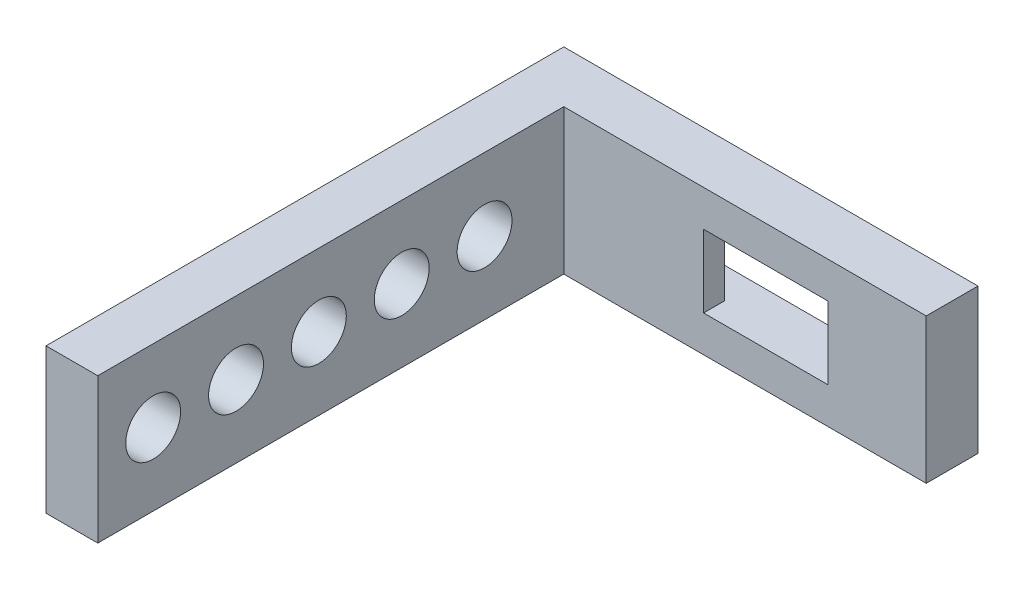
ISO-10303-21;
HEADER;
FILE_DESCRIPTION(('STEP AP214'),'2;1');
FILE_NAME('part.step','',(''),(''),'','','');
FILE_SCHEMA(('AUTOMOTIVE_DESIGN { 1 0 10303 214 1 1 1 1 }'));
ENDSEC;
DATA;
#1=APPLICATION_CONTEXT('core data for automotive mechanical design processes');
#2=APPLICATION_PROTOCOL_DEFINITION('international standard','automotive_design',2000,#1);
#3=PRODUCT_CONTEXT('',#1,'mechanical');
#4=PRODUCT('Part','Part','',(#3));
#5=PRODUCT_RELATED_PRODUCT_CATEGORY('part','',(#4));
#6=PRODUCT_DEFINITION_FORMATION('','',#4);
#7=PRODUCT_DEFINITION_CONTEXT('part definition',#1,'design');
#8=PRODUCT_DEFINITION('design','',#6,#7);
#9=PRODUCT_DEFINITION_SHAPE('','',#8);
#10=(LENGTH_UNIT() NAMED_UNIT(*) SI_UNIT(.MILLI.,.METRE.));
#11=(NAMED_UNIT(*) PLANE_ANGLE_UNIT() SI_UNIT($,.RADIAN.));
#12=(NAMED_UNIT(*) SI_UNIT($,.STERADIAN.) SOLID_ANGLE_UNIT());
#13=UNCERTAINTY_MEASURE_WITH_UNIT(LENGTH_MEASURE(1.E-05),#10,'distance_accuracy_value','');
#14=(GEOMETRIC_REPRESENTATION_CONTEXT(3) GLOBAL_UNCERTAINTY_ASSIGNED_CONTEXT((#13)) GLOBAL_UNIT_ASSIGNED_CONTEXT((#10,
#11,#12)) REPRESENTATION_CONTEXT('',''));
#15=CARTESIAN_POINT('',(0.,0.,0.));
#16=DIRECTION('',(0.,0.,1.));
#17=DIRECTION('',(1.,0.,0.));
#18=AXIS2_PLACEMENT_3D('',#15,#16,#17);
#19=CARTESIAN_POINT('',(0.,0.,-6.));
#20=DIRECTION('',(0.,0.,1.));
#21=DIRECTION('',(1.,0.,0.));
#22=AXIS2_PLACEMENT_3D('',#19,#20,#21);
#23=PLANE('',#22);
#24=DIRECTION('',(0.,-1.,0.));
#25=VECTOR('',#24,1.);
#26=CARTESIAN_POINT('',(30.5,10.5,-6.));
#27=LINE('',#26,#25);
#28=CARTESIAN_POINT('',(30.5,10.5,-6.));
#29=VERTEX_POINT('',#28);
#30=CARTESIAN_POINT('',(30.5,3.5,-6.));
#31=VERTEX_POINT('',#30);
#32=EDGE_CURVE('E143',#29,#31,#27,.T.);
#33=ORIENTED_EDGE('',*,*,#32,.F.);
#34=DIRECTION('',(1.,0.,0.));
#35=VECTOR('',#34,1.);
#36=CARTESIAN_POINT('',(12.,10.5,-6.));
#37=LINE('',#36,#35);
#38=CARTESIAN_POINT('',(37.,10.5,-6.));
#39=VERTEX_POINT('',#38);
#40=EDGE_CURVE('E174',#29,#39,#37,.T.);
#41=ORIENTED_EDGE('',*,*,#40,.T.);
#42=DIRECTION('',(0.,-1.,0.));
#43=VECTOR('',#42,1.);
#44=CARTESIAN_POINT('',(37.,10.5,-6.));
#45=LINE('',#44,#43);
#46=CARTESIAN_POINT('',(37.,3.5,-6.));
#47=VERTEX_POINT('',#46);
#48=EDGE_CURVE('E179',#39,#47,#45,.T.);
#49=ORIENTED_EDGE('',*,*,#48,.T.);
#50=DIRECTION('',(-1.,0.,0.));
#51=VECTOR('',#50,1.);
#52=CARTESIAN_POINT('',(12.,3.5,-6.));
#53=LINE('',#52,#51);
#54=EDGE_CURVE('E183',#47,#31,#53,.T.);
#55=ORIENTED_EDGE('',*,*,#54,.T.);
#56=EDGE_LOOP('',(#33,#41,#49,#55));
#57=FACE_BOUND('',#56,.T.);
#58=ADVANCED_FACE('F36',(#57),#23,.F.);
#59=DIRECTION('',(0.,1.,0.));
#60=VECTOR('',#59,1.);
#61=CARTESIAN_POINT('',(18.5,10.5,-6.));
#62=LINE('',#61,#60);
#63=CARTESIAN_POINT('',(18.5,3.5,-6.));
#64=VERTEX_POINT('',#63);
#65=CARTESIAN_POINT('',(18.5,10.5,-6.));
#66=VERTEX_POINT('',#65);
#67=EDGE_CURVE('E147',#64,#66,#62,.T.);
#68=ORIENTED_EDGE('',*,*,#67,.F.);
#69=CARTESIAN_POINT('',(12.,3.5,-6.));
#70=VERTEX_POINT('',#69);
#71=EDGE_CURVE('E182',#64,#70,#53,.T.);
#72=ORIENTED_EDGE('',*,*,#71,.T.);
#73=DIRECTION('',(0.,1.,0.));
#74=VECTOR('',#73,1.);
#75=CARTESIAN_POINT('',(12.,10.5,-6.));
#76=LINE('',#75,#74);
#77=CARTESIAN_POINT('',(12.,10.5,-6.));
#78=VERTEX_POINT('',#77);
#79=EDGE_CURVE('E171',#70,#78,#76,.T.);
#80=ORIENTED_EDGE('',*,*,#79,.T.);
#81=EDGE_CURVE('E176',#78,#66,#37,.T.);
#82=ORIENTED_EDGE('',*,*,#81,.T.);
#83=EDGE_LOOP('',(#68,#72,#80,#82));
#84=FACE_BOUND('',#83,.T.);
#85=ADVANCED_FACE('F301',(#84),#23,.F.);
#86=CARTESIAN_POINT('',(10.,14.,-4.));
#87=DIRECTION('',(0.,0.,-1.));
#88=DIRECTION('',(-1.,0.,0.));
#89=AXIS2_PLACEMENT_3D('',#86,#87,#88);
#90=PLANE('',#89);
#91=DIRECTION('',(-1.,0.,0.));
#92=VECTOR('',#91,1.);
#93=CARTESIAN_POINT('',(18.5,10.5,-4.));
#94=LINE('',#93,#92);
#95=CARTESIAN_POINT('',(30.5,10.5,-4.));
#96=VERTEX_POINT('',#95);
#97=CARTESIAN_POINT('',(18.5,10.5,-4.));
#98=VERTEX_POINT('',#97);
#99=EDGE_CURVE('E160',#96,#98,#94,.T.);
#100=ORIENTED_EDGE('',*,*,#99,.F.);
#101=DIRECTION('',(0.,1.,0.));
#102=VECTOR('',#101,1.);
#103=CARTESIAN_POINT('',(30.5,10.5,-4.));
#104=LINE('',#103,#102);
#105=CARTESIAN_POINT('',(30.5,3.5,-4.));
#106=VERTEX_POINT('',#105);
#107=EDGE_CURVE('E140',#106,#96,#104,.T.);
#108=ORIENTED_EDGE('',*,*,#107,.F.);
#109=DIRECTION('',(1.,0.,0.));
#110=VECTOR('',#109,1.);
#111=CARTESIAN_POINT('',(18.5,3.5,-4.));
#112=LINE('',#111,#110);
#113=CARTESIAN_POINT('',(18.5,3.5,-4.));
#114=VERTEX_POINT('',#113);
#115=EDGE_CURVE('E150',#114,#106,#112,.T.);
#116=ORIENTED_EDGE('',*,*,#115,.F.);
#117=DIRECTION('',(0.,-1.,0.));
#118=VECTOR('',#117,1.);
#119=CARTESIAN_POINT('',(18.5,10.5,-4.));
#120=LINE('',#119,#118);
#121=EDGE_CURVE('E56',#98,#114,#120,.T.);
#122=ORIENTED_EDGE('',*,*,#121,.F.);
#123=EDGE_LOOP('',(#100,#108,#116,#122));
#124=FACE_BOUND('',#123,.T.);
#125=DIRECTION('',(1.,0.,0.));
#126=VECTOR('',#125,1.);
#127=CARTESIAN_POINT('',(10.,0.,-4.));
#128=LINE('',#127,#126);
#129=CARTESIAN_POINT('',(5.,0.,-4.));
#130=VERTEX_POINT('',#129);
#131=CARTESIAN_POINT('',(40.,0.,-4.));
#132=VERTEX_POINT('',#131);
#133=EDGE_CURVE('E250',#130,#132,#128,.T.);
#134=ORIENTED_EDGE('',*,*,#133,.T.);
#135=DIRECTION('',(0.,-1.,0.));
#136=VECTOR('',#135,1.);
#137=CARTESIAN_POINT('',(40.,14.,-4.));
#138=LINE('',#137,#136);
#139=CARTESIAN_POINT('',(40.,14.,-4.));
#140=VERTEX_POINT('',#139);
#141=EDGE_CURVE('E11',#140,#132,#138,.T.);
#142=ORIENTED_EDGE('',*,*,#141,.F.);
#143=DIRECTION('',(1.,0.,0.));
#144=VECTOR('',#143,1.);
#145=CARTESIAN_POINT('',(10.,14.,-4.));
#146=LINE('',#145,#144);
#147=CARTESIAN_POINT('',(5.,14.,-4.));
#148=VERTEX_POINT('',#147);
#149=EDGE_CURVE('E253',#148,#140,#146,.T.);
#150=ORIENTED_EDGE('',*,*,#149,.F.);
#151=DIRECTION('',(0.,1.,0.));
#152=VECTOR('',#151,1.);
#153=CARTESIAN_POINT('',(5.,0.,-4.));
#154=LINE('',#153,#152);
#155=EDGE_CURVE('E196',#130,#148,#154,.T.);
#156=ORIENTED_EDGE('',*,*,#155,.F.);
#157=EDGE_LOOP('',(#134,#142,#150,#156));
#158=FACE_BOUND('',#157,.T.);
#159=ADVANCED_FACE('F38',(#124,#158),#90,.F.);
#160=CARTESIAN_POINT('',(40.,14.,-9.));
#161=DIRECTION('',(-1.,0.,0.));
#162=DIRECTION('',(0.,0.,1.));
#163=AXIS2_PLACEMENT_3D('',#160,#161,#162);
#164=PLANE('',#163);
#165=DIRECTION('',(0.,0.,-1.));
#166=VECTOR('',#165,1.);
#167=CARTESIAN_POINT('',(40.,0.,-9.));
#168=LINE('',#167,#166);
#169=CARTESIAN_POINT('',(40.,0.,-9.));
#170=VERTEX_POINT('',#169);
#171=EDGE_CURVE('E264',#132,#170,#168,.T.);
#172=ORIENTED_EDGE('',*,*,#171,.T.);
#173=DIRECTION('',(0.,-1.,0.));
#174=VECTOR('',#173,1.);
#175=CARTESIAN_POINT('',(40.,14.,-9.));
#176=LINE('',#175,#174);
#177=CARTESIAN_POINT('',(40.,14.,-9.));
#178=VERTEX_POINT('',#177);
#179=EDGE_CURVE('E44',#178,#170,#176,.T.);
#180=ORIENTED_EDGE('',*,*,#179,.F.);
#181=DIRECTION('',(0.,0.,-1.));
#182=VECTOR('',#181,1.);
#183=CARTESIAN_POINT('',(40.,14.,-9.));
#184=LINE('',#183,#182);
#185=EDGE_CURVE('E255',#140,#178,#184,.T.);
#186=ORIENTED_EDGE('',*,*,#185,.F.);
#187=ORIENTED_EDGE('',*,*,#141,.T.);
#188=EDGE_LOOP('',(#172,#180,#186,#187));
#189=FACE_BOUND('',#188,.T.);
#190=ADVANCED_FACE('F279',(#189),#164,.F.);
#191=CARTESIAN_POINT('',(0.,14.,-9.));
#192=DIRECTION('',(0.,0.,1.));
#193=DIRECTION('',(1.,0.,0.));
#194=AXIS2_PLACEMENT_3D('',#191,#192,#193);
#195=PLANE('',#194);
#196=DIRECTION('',(1.,0.,0.));
#197=VECTOR('',#196,1.);
#198=CARTESIAN_POINT('',(12.,10.5,-9.));
#199=LINE('',#198,#197);
#200=CARTESIAN_POINT('',(12.,10.5,-9.));
#201=VERTEX_POINT('',#200);
#202=CARTESIAN_POINT('',(37.,10.5,-9.));
#203=VERTEX_POINT('',#202);
#204=EDGE_CURVE('E187',#201,#203,#199,.T.);
#205=ORIENTED_EDGE('',*,*,#204,.F.);
#206=DIRECTION('',(0.,1.,0.));
#207=VECTOR('',#206,1.);
#208=CARTESIAN_POINT('',(12.,10.5,-9.));
#209=LINE('',#208,#207);
#210=CARTESIAN_POINT('',(12.,3.5,-9.));
#211=VERTEX_POINT('',#210);
#212=EDGE_CURVE('E155',#211,#201,#209,.T.);
#213=ORIENTED_EDGE('',*,*,#212,.F.);
#214=DIRECTION('',(-1.,0.,0.));
#215=VECTOR('',#214,1.);
#216=CARTESIAN_POINT('',(12.,3.5,-9.));
#217=LINE('',#216,#215);
#218=CARTESIAN_POINT('',(37.,3.5,-9.));
#219=VERTEX_POINT('',#218);
#220=EDGE_CURVE('E175',#219,#211,#217,.T.);
#221=ORIENTED_EDGE('',*,*,#220,.F.);
#222=DIRECTION('',(0.,-1.,0.));
#223=VECTOR('',#222,1.);
#224=CARTESIAN_POINT('',(37.,10.5,-9.));
#225=LINE('',#224,#223);
#226=EDGE_CURVE('E190',#203,#219,#225,.T.);
#227=ORIENTED_EDGE('',*,*,#226,.F.);
#228=EDGE_LOOP('',(#205,#213,#221,#227));
#229=FACE_BOUND('',#228,.T.);
#230=DIRECTION('',(-1.,0.,0.));
#231=VECTOR('',#230,1.);
#232=CARTESIAN_POINT('',(0.,0.,-9.));
#233=LINE('',#232,#231);
#234=CARTESIAN_POINT('',(0.,0.,-9.));
#235=VERTEX_POINT('',#234);
#236=EDGE_CURVE('E267',#170,#235,#233,.T.);
#237=ORIENTED_EDGE('',*,*,#236,.T.);
#238=DIRECTION('',(0.,-1.,0.));
#239=VECTOR('',#238,1.);
#240=CARTESIAN_POINT('',(0.,14.,-9.));
#241=LINE('',#240,#239);
#242=CARTESIAN_POINT('',(0.,14.,-9.));
#243=VERTEX_POINT('',#242);
#244=EDGE_CURVE('E262',#243,#235,#241,.T.);
#245=ORIENTED_EDGE('',*,*,#244,.F.);
#246=DIRECTION('',(-1.,0.,0.));
#247=VECTOR('',#246,1.);
#248=CARTESIAN_POINT('',(11.5890955973018,14.,-9.));
#249=LINE('',#248,#247);
#250=EDGE_CURVE('E258',#178,#243,#249,.T.);
#251=ORIENTED_EDGE('',*,*,#250,.F.);
#252=ORIENTED_EDGE('',*,*,#179,.T.);
#253=EDGE_LOOP('',(#237,#245,#251,#252));
#254=FACE_BOUND('',#253,.T.);
#255=ADVANCED_FACE('F275',(#229,#254),#195,.F.);
#256=CARTESIAN_POINT('',(0.,14.,0.));
#257=DIRECTION('',(1.,0.,0.));
#258=DIRECTION('',(0.,0.,-1.));
#259=AXIS2_PLACEMENT_3D('',#256,#257,#258);
#260=PLANE('',#259);
#261=CARTESIAN_POINT('',(0.,6.99999999999999,3.65));
#262=DIRECTION('',(-1.,0.,0.));
#263=DIRECTION('',(0.,0.,1.));
#264=AXIS2_PLACEMENT_3D('',#261,#262,#263);
#265=CIRCLE('',#264,2.65);
#266=CARTESIAN_POINT('',(0.,6.99999999999999,6.3));
#267=VERTEX_POINT('',#266);
#268=EDGE_CURVE('E208',#267,#267,#265,.T.);
#269=ORIENTED_EDGE('',*,*,#268,.F.);
#270=EDGE_LOOP('',(#269));
#271=FACE_BOUND('',#270,.T.);
#272=CARTESIAN_POINT('',(0.,6.99999999999999,11.65));
#273=DIRECTION('',(-1.,0.,0.));
#274=DIRECTION('',(0.,0.,1.));
#275=AXIS2_PLACEMENT_3D('',#272,#273,#274);
#276=CIRCLE('',#275,2.65);
#277=CARTESIAN_POINT('',(0.,6.99999999999999,14.3));
#278=VERTEX_POINT('',#277);
#279=EDGE_CURVE('E209',#278,#278,#276,.T.);
#280=ORIENTED_EDGE('',*,*,#279,.F.);
#281=EDGE_LOOP('',(#280));
#282=FACE_BOUND('',#281,.T.);
#283=CARTESIAN_POINT('',(0.,6.99999999999999,19.65));
#284=DIRECTION('',(-1.,0.,0.));
#285=DIRECTION('',(0.,0.,1.));
#286=AXIS2_PLACEMENT_3D('',#283,#284,#285);
#287=CIRCLE('',#286,2.65);
#288=CARTESIAN_POINT('',(0.,6.99999999999999,22.3));
#289=VERTEX_POINT('',#288);
#290=EDGE_CURVE('E216',#289,#289,#287,.T.);
#291=ORIENTED_EDGE('',*,*,#290,.F.);
#292=EDGE_LOOP('',(#291));
#293=FACE_BOUND('',#292,.T.);
#294=CARTESIAN_POINT('',(0.,6.99999999999999,27.65));
#295=DIRECTION('',(-1.,0.,0.));
#296=DIRECTION('',(0.,0.,1.));
#297=AXIS2_PLACEMENT_3D('',#294,#295,#296);
#298=CIRCLE('',#297,2.65);
#299=CARTESIAN_POINT('',(0.,6.99999999999999,30.3));
#300=VERTEX_POINT('',#299);
#301=EDGE_CURVE('E222',#300,#300,#298,.T.);
#302=ORIENTED_EDGE('',*,*,#301,.F.);
#303=EDGE_LOOP('',(#302));
#304=FACE_BOUND('',#303,.T.);
#305=CARTESIAN_POINT('',(0.,6.99999999999999,35.65));
#306=DIRECTION('',(-1.,0.,0.));
#307=DIRECTION('',(0.,0.,1.));
#308=AXIS2_PLACEMENT_3D('',#305,#306,#307);
#309=CIRCLE('',#308,2.65);
#310=CARTESIAN_POINT('',(0.,6.99999999999999,38.3));
#311=VERTEX_POINT('',#310);
#312=EDGE_CURVE('E228',#311,#311,#309,.T.);
#313=ORIENTED_EDGE('',*,*,#312,.F.);
#314=EDGE_LOOP('',(#313));
#315=FACE_BOUND('',#314,.T.);
#316=DIRECTION('',(0.,0.,1.));
#317=VECTOR('',#316,1.);
#318=CARTESIAN_POINT('',(0.,0.,0.));
#319=LINE('',#318,#317);
#320=CARTESIAN_POINT('',(0.,0.,41.));
#321=VERTEX_POINT('',#320);
#322=EDGE_CURVE('E256',#235,#321,#319,.T.);
#323=ORIENTED_EDGE('',*,*,#322,.T.);
#324=DIRECTION('',(0.,1.,0.));
#325=VECTOR('',#324,1.);
#326=CARTESIAN_POINT('',(0.,0.,41.));
#327=LINE('',#326,#325);
#328=CARTESIAN_POINT('',(0.,14.,41.));
#329=VERTEX_POINT('',#328);
#330=EDGE_CURVE('E212',#321,#329,#327,.T.);
#331=ORIENTED_EDGE('',*,*,#330,.T.);
#332=DIRECTION('',(0.,0.,1.));
#333=VECTOR('',#332,1.);
#334=CARTESIAN_POINT('',(0.,14.,0.));
#335=LINE('',#334,#333);
#336=EDGE_CURVE('E260',#243,#329,#335,.T.);
#337=ORIENTED_EDGE('',*,*,#336,.F.);
#338=ORIENTED_EDGE('',*,*,#244,.T.);
#339=EDGE_LOOP('',(#323,#331,#337,#338));
#340=FACE_BOUND('',#339,.T.);
#341=ADVANCED_FACE('F288',(#271,#282,#293,#304,#315,#340),#260,.F.);
#342=CARTESIAN_POINT('',(0.,14.,0.));
#343=DIRECTION('',(0.,-1.,0.));
#344=DIRECTION('',(0.,0.,-1.));
#345=AXIS2_PLACEMENT_3D('',#342,#343,#344);
#346=PLANE('',#345);
#347=DIRECTION('',(0.,0.,-1.));
#348=VECTOR('',#347,1.);
#349=CARTESIAN_POINT('',(5.,14.,0.));
#350=LINE('',#349,#348);
#351=CARTESIAN_POINT('',(5.,14.,41.));
#352=VERTEX_POINT('',#351);
#353=EDGE_CURVE('E241',#352,#148,#350,.T.);
#354=ORIENTED_EDGE('',*,*,#353,.T.);
#355=ORIENTED_EDGE('',*,*,#149,.T.);
#356=ORIENTED_EDGE('',*,*,#185,.T.);
#357=ORIENTED_EDGE('',*,*,#250,.T.);
#358=ORIENTED_EDGE('',*,*,#336,.T.);
#359=DIRECTION('',(-1.,0.,0.));
#360=VECTOR('',#359,1.);
#361=CARTESIAN_POINT('',(5.,14.,41.));
#362=LINE('',#361,#360);
#363=EDGE_CURVE('E247',#352,#329,#362,.T.);
#364=ORIENTED_EDGE('',*,*,#363,.F.);
#365=EDGE_LOOP('',(#354,#355,#356,#357,#358,#364));
#366=FACE_BOUND('',#365,.T.);
#367=ADVANCED_FACE('F291',(#366),#346,.F.);
#368=CARTESIAN_POINT('',(0.,0.,0.));
#369=DIRECTION('',(0.,-1.,0.));
#370=DIRECTION('',(0.,0.,-1.));
#371=AXIS2_PLACEMENT_3D('',#368,#369,#370);
#372=PLANE('',#371);
#373=ORIENTED_EDGE('',*,*,#133,.F.);
#374=DIRECTION('',(0.,0.,1.));
#375=VECTOR('',#374,1.);
#376=CARTESIAN_POINT('',(5.,0.,0.));
#377=LINE('',#376,#375);
#378=CARTESIAN_POINT('',(5.,0.,41.));
#379=VERTEX_POINT('',#378);
#380=EDGE_CURVE('E235',#130,#379,#377,.T.);
#381=ORIENTED_EDGE('',*,*,#380,.T.);
#382=DIRECTION('',(-1.,0.,0.));
#383=VECTOR('',#382,1.);
#384=CARTESIAN_POINT('',(5.,0.,41.));
#385=LINE('',#384,#383);
#386=EDGE_CURVE('E244',#379,#321,#385,.T.);
#387=ORIENTED_EDGE('',*,*,#386,.T.);
#388=ORIENTED_EDGE('',*,*,#322,.F.);
#389=ORIENTED_EDGE('',*,*,#236,.F.);
#390=ORIENTED_EDGE('',*,*,#171,.F.);
#391=EDGE_LOOP('',(#373,#381,#387,#388,#389,#390));
#392=FACE_BOUND('',#391,.T.);
#393=ADVANCED_FACE('F283',(#392),#372,.T.);
#394=CARTESIAN_POINT('',(5.,0.,41.));
#395=DIRECTION('',(0.,0.,1.));
#396=DIRECTION('',(1.,0.,0.));
#397=AXIS2_PLACEMENT_3D('',#394,#395,#396);
#398=PLANE('',#397);
#399=ORIENTED_EDGE('',*,*,#330,.F.);
#400=ORIENTED_EDGE('',*,*,#386,.F.);
#401=DIRECTION('',(0.,1.,0.));
#402=VECTOR('',#401,1.);
#403=CARTESIAN_POINT('',(5.,0.,41.));
#404=LINE('',#403,#402);
#405=EDGE_CURVE('E238',#379,#352,#404,.T.);
#406=ORIENTED_EDGE('',*,*,#405,.T.);
#407=ORIENTED_EDGE('',*,*,#363,.T.);
#408=EDGE_LOOP('',(#399,#400,#406,#407));
#409=FACE_BOUND('',#408,.T.);
#410=ADVANCED_FACE('F293',(#409),#398,.T.);
#411=CARTESIAN_POINT('',(5.,0.,0.));
#412=DIRECTION('',(1.,0.,0.));
#413=DIRECTION('',(0.,0.,-1.));
#414=AXIS2_PLACEMENT_3D('',#411,#412,#413);
#415=PLANE('',#414);
#416=CARTESIAN_POINT('',(5.,6.99999999999999,3.65));
#417=DIRECTION('',(1.,0.,0.));
#418=DIRECTION('',(0.,0.,-1.));
#419=AXIS2_PLACEMENT_3D('',#416,#417,#418);
#420=CIRCLE('',#419,2.65);
#421=CARTESIAN_POINT('',(5.,6.99999999999999,1.));
#422=VERTEX_POINT('',#421);
#423=EDGE_CURVE('E205',#422,#422,#420,.F.);
#424=ORIENTED_EDGE('',*,*,#423,.T.);
#425=EDGE_LOOP('',(#424));
#426=FACE_BOUND('',#425,.T.);
#427=CARTESIAN_POINT('',(5.,6.99999999999999,11.65));
#428=DIRECTION('',(1.,0.,0.));
#429=DIRECTION('',(0.,0.,-1.));
#430=AXIS2_PLACEMENT_3D('',#427,#428,#429);
#431=CIRCLE('',#430,2.65);
#432=CARTESIAN_POINT('',(5.,6.99999999999999,9.));
#433=VERTEX_POINT('',#432);
#434=EDGE_CURVE('E213',#433,#433,#431,.F.);
#435=ORIENTED_EDGE('',*,*,#434,.T.);
#436=EDGE_LOOP('',(#435));
#437=FACE_BOUND('',#436,.T.);
#438=CARTESIAN_POINT('',(5.,6.99999999999999,19.65));
#439=DIRECTION('',(1.,0.,0.));
#440=DIRECTION('',(0.,0.,-1.));
#441=AXIS2_PLACEMENT_3D('',#438,#439,#440);
#442=CIRCLE('',#441,2.65);
#443=CARTESIAN_POINT('',(5.,6.99999999999999,17.));
#444=VERTEX_POINT('',#443);
#445=EDGE_CURVE('E219',#444,#444,#442,.F.);
#446=ORIENTED_EDGE('',*,*,#445,.T.);
#447=EDGE_LOOP('',(#446));
#448=FACE_BOUND('',#447,.T.);
#449=CARTESIAN_POINT('',(5.,6.99999999999999,27.65));
#450=DIRECTION('',(1.,0.,0.));
#451=DIRECTION('',(0.,0.,-1.));
#452=AXIS2_PLACEMENT_3D('',#449,#450,#451);
#453=CIRCLE('',#452,2.65);
#454=CARTESIAN_POINT('',(5.,6.99999999999999,25.));
#455=VERTEX_POINT('',#454);
#456=EDGE_CURVE('E225',#455,#455,#453,.F.);
#457=ORIENTED_EDGE('',*,*,#456,.T.);
#458=EDGE_LOOP('',(#457));
#459=FACE_BOUND('',#458,.T.);
#460=CARTESIAN_POINT('',(5.,6.99999999999999,35.65));
#461=DIRECTION('',(1.,0.,0.));
#462=DIRECTION('',(0.,0.,-1.));
#463=AXIS2_PLACEMENT_3D('',#460,#461,#462);
#464=CIRCLE('',#463,2.65);
#465=CARTESIAN_POINT('',(5.,6.99999999999999,33.));
#466=VERTEX_POINT('',#465);
#467=EDGE_CURVE('E204',#466,#466,#464,.F.);
#468=ORIENTED_EDGE('',*,*,#467,.T.);
#469=EDGE_LOOP('',(#468));
#470=FACE_BOUND('',#469,.T.);
#471=ORIENTED_EDGE('',*,*,#380,.F.);
#472=ORIENTED_EDGE('',*,*,#155,.T.);
#473=ORIENTED_EDGE('',*,*,#353,.F.);
#474=ORIENTED_EDGE('',*,*,#405,.F.);
#475=EDGE_LOOP('',(#471,#472,#473,#474));
#476=FACE_BOUND('',#475,.T.);
#477=ADVANCED_FACE('F297',(#426,#437,#448,#459,#470,#476),#415,.T.);
#478=CARTESIAN_POINT('',(12.4953318805774,6.99999999999999,35.65));
#479=DIRECTION('',(-1.,0.,0.));
#480=DIRECTION('',(0.,0.,1.));
#481=AXIS2_PLACEMENT_3D('',#478,#479,#480);
#482=CYLINDRICAL_SURFACE('',#481,2.65);
#483=ORIENTED_EDGE('',*,*,#312,.T.);
#484=EDGE_LOOP('',(#483));
#485=FACE_BOUND('',#484,.T.);
#486=ORIENTED_EDGE('',*,*,#467,.F.);
#487=EDGE_LOOP('',(#486));
#488=FACE_BOUND('',#487,.T.);
#489=ADVANCED_FACE('F344',(#485,#488),#482,.F.);
#490=CARTESIAN_POINT('',(12.4953318805774,6.99999999999999,27.65));
#491=DIRECTION('',(-1.,0.,0.));
#492=DIRECTION('',(0.,0.,1.));
#493=AXIS2_PLACEMENT_3D('',#490,#491,#492);
#494=CYLINDRICAL_SURFACE('',#493,2.65);
#495=ORIENTED_EDGE('',*,*,#301,.T.);
#496=EDGE_LOOP('',(#495));
#497=FACE_BOUND('',#496,.T.);
#498=ORIENTED_EDGE('',*,*,#456,.F.);
#499=EDGE_LOOP('',(#498));
#500=FACE_BOUND('',#499,.T.);
#501=ADVANCED_FACE('F340',(#497,#500),#494,.F.);
#502=CARTESIAN_POINT('',(12.4953318805774,6.99999999999999,19.65));
#503=DIRECTION('',(-1.,0.,0.));
#504=DIRECTION('',(0.,0.,1.));
#505=AXIS2_PLACEMENT_3D('',#502,#503,#504);
#506=CYLINDRICAL_SURFACE('',#505,2.65);
#507=ORIENTED_EDGE('',*,*,#290,.T.);
#508=EDGE_LOOP('',(#507));
#509=FACE_BOUND('',#508,.T.);
#510=ORIENTED_EDGE('',*,*,#445,.F.);
#511=EDGE_LOOP('',(#510));
#512=FACE_BOUND('',#511,.T.);
#513=ADVANCED_FACE('F336',(#509,#512),#506,.F.);
#514=CARTESIAN_POINT('',(12.4953318805774,6.99999999999999,11.65));
#515=DIRECTION('',(-1.,0.,0.));
#516=DIRECTION('',(0.,0.,1.));
#517=AXIS2_PLACEMENT_3D('',#514,#515,#516);
#518=CYLINDRICAL_SURFACE('',#517,2.65);
#519=ORIENTED_EDGE('',*,*,#279,.T.);
#520=EDGE_LOOP('',(#519));
#521=FACE_BOUND('',#520,.T.);
#522=ORIENTED_EDGE('',*,*,#434,.F.);
#523=EDGE_LOOP('',(#522));
#524=FACE_BOUND('',#523,.T.);
#525=ADVANCED_FACE('F332',(#521,#524),#518,.F.);
#526=CARTESIAN_POINT('',(12.4953318805774,6.99999999999999,3.65));
#527=DIRECTION('',(-1.,0.,0.));
#528=DIRECTION('',(0.,0.,1.));
#529=AXIS2_PLACEMENT_3D('',#526,#527,#528);
#530=CYLINDRICAL_SURFACE('',#529,2.65);
#531=ORIENTED_EDGE('',*,*,#268,.T.);
#532=EDGE_LOOP('',(#531));
#533=FACE_BOUND('',#532,.T.);
#534=ORIENTED_EDGE('',*,*,#423,.F.);
#535=EDGE_LOOP('',(#534));
#536=FACE_BOUND('',#535,.T.);
#537=ADVANCED_FACE('F328',(#533,#536),#530,.F.);
#538=CARTESIAN_POINT('',(12.,10.5,-6.));
#539=DIRECTION('',(-1.,0.,0.));
#540=DIRECTION('',(0.,0.,1.));
#541=AXIS2_PLACEMENT_3D('',#538,#539,#540);
#542=PLANE('',#541);
#543=ORIENTED_EDGE('',*,*,#212,.T.);
#544=DIRECTION('',(0.,0.,-1.));
#545=VECTOR('',#544,1.);
#546=CARTESIAN_POINT('',(12.,10.5,-6.));
#547=LINE('',#546,#545);
#548=EDGE_CURVE('E185',#78,#201,#547,.T.);
#549=ORIENTED_EDGE('',*,*,#548,.F.);
#550=ORIENTED_EDGE('',*,*,#79,.F.);
#551=DIRECTION('',(0.,0.,-1.));
#552=VECTOR('',#551,1.);
#553=CARTESIAN_POINT('',(12.,3.5,-6.));
#554=LINE('',#553,#552);
#555=EDGE_CURVE('E194',#70,#211,#554,.T.);
#556=ORIENTED_EDGE('',*,*,#555,.T.);
#557=EDGE_LOOP('',(#543,#549,#550,#556));
#558=FACE_BOUND('',#557,.T.);
#559=ADVANCED_FACE('F318',(#558),#542,.F.);
#560=CARTESIAN_POINT('',(12.,3.5,-6.));
#561=DIRECTION('',(0.,-1.,0.));
#562=DIRECTION('',(1.,0.,0.));
#563=AXIS2_PLACEMENT_3D('',#560,#561,#562);
#564=PLANE('',#563);
#565=ORIENTED_EDGE('',*,*,#220,.T.);
#566=ORIENTED_EDGE('',*,*,#555,.F.);
#567=ORIENTED_EDGE('',*,*,#71,.F.);
#568=DIRECTION('',(0.,0.,-1.));
#569=VECTOR('',#568,1.);
#570=CARTESIAN_POINT('',(18.5,3.5,41.001));
#571=LINE('',#570,#569);
#572=EDGE_CURVE('E51',#114,#64,#571,.T.);
#573=ORIENTED_EDGE('',*,*,#572,.F.);
#574=ORIENTED_EDGE('',*,*,#115,.T.);
#575=DIRECTION('',(0.,0.,-1.));
#576=VECTOR('',#575,1.);
#577=CARTESIAN_POINT('',(30.5,3.5,41.001));
#578=LINE('',#577,#576);
#579=EDGE_CURVE('E136',#106,#31,#578,.T.);
#580=ORIENTED_EDGE('',*,*,#579,.T.);
#581=ORIENTED_EDGE('',*,*,#54,.F.);
#582=DIRECTION('',(0.,0.,-1.));
#583=VECTOR('',#582,1.);
#584=CARTESIAN_POINT('',(37.,3.5,-6.));
#585=LINE('',#584,#583);
#586=EDGE_CURVE('E197',#47,#219,#585,.T.);
#587=ORIENTED_EDGE('',*,*,#586,.T.);
#588=EDGE_LOOP('',(#565,#566,#567,#573,#574,#580,#581,#587));
#589=FACE_BOUND('',#588,.T.);
#590=ADVANCED_FACE('F152',(#589),#564,.F.);
#591=CARTESIAN_POINT('',(37.,10.5,-6.));
#592=DIRECTION('',(1.,0.,0.));
#593=DIRECTION('',(0.,0.,-1.));
#594=AXIS2_PLACEMENT_3D('',#591,#592,#593);
#595=PLANE('',#594);
#596=ORIENTED_EDGE('',*,*,#226,.T.);
#597=ORIENTED_EDGE('',*,*,#586,.F.);
#598=ORIENTED_EDGE('',*,*,#48,.F.);
#599=DIRECTION('',(0.,0.,-1.));
#600=VECTOR('',#599,1.);
#601=CARTESIAN_POINT('',(37.,10.5,-6.));
#602=LINE('',#601,#600);
#603=EDGE_CURVE('E199',#39,#203,#602,.T.);
#604=ORIENTED_EDGE('',*,*,#603,.T.);
#605=EDGE_LOOP('',(#596,#597,#598,#604));
#606=FACE_BOUND('',#605,.T.);
#607=ADVANCED_FACE('F317',(#606),#595,.F.);
#608=CARTESIAN_POINT('',(12.,10.5,-6.));
#609=DIRECTION('',(0.,1.,0.));
#610=DIRECTION('',(-1.,0.,0.));
#611=AXIS2_PLACEMENT_3D('',#608,#609,#610);
#612=PLANE('',#611);
#613=ORIENTED_EDGE('',*,*,#204,.T.);
#614=ORIENTED_EDGE('',*,*,#603,.F.);
#615=ORIENTED_EDGE('',*,*,#40,.F.);
#616=DIRECTION('',(0.,0.,-1.));
#617=VECTOR('',#616,1.);
#618=CARTESIAN_POINT('',(30.5,10.5,41.001));
#619=LINE('',#618,#617);
#620=EDGE_CURVE('E156',#96,#29,#619,.T.);
#621=ORIENTED_EDGE('',*,*,#620,.F.);
#622=ORIENTED_EDGE('',*,*,#99,.T.);
#623=DIRECTION('',(0.,0.,-1.));
#624=VECTOR('',#623,1.);
#625=CARTESIAN_POINT('',(18.5,10.5,41.001));
#626=LINE('',#625,#624);
#627=EDGE_CURVE('E168',#98,#66,#626,.T.);
#628=ORIENTED_EDGE('',*,*,#627,.T.);
#629=ORIENTED_EDGE('',*,*,#81,.F.);
#630=ORIENTED_EDGE('',*,*,#548,.T.);
#631=EDGE_LOOP('',(#613,#614,#615,#621,#622,#628,#629,#630));
#632=FACE_BOUND('',#631,.T.);
#633=ADVANCED_FACE('F321',(#632),#612,.F.);
#634=CARTESIAN_POINT('',(30.5,10.5,41.001));
#635=DIRECTION('',(1.,0.,0.));
#636=DIRECTION('',(0.,0.,-1.));
#637=AXIS2_PLACEMENT_3D('',#634,#635,#636);
#638=PLANE('',#637);
#639=ORIENTED_EDGE('',*,*,#107,.T.);
#640=ORIENTED_EDGE('',*,*,#620,.T.);
#641=ORIENTED_EDGE('',*,*,#32,.T.);
#642=ORIENTED_EDGE('',*,*,#579,.F.);
#643=EDGE_LOOP('',(#639,#640,#641,#642));
#644=FACE_BOUND('',#643,.T.);
#645=ADVANCED_FACE('F138',(#644),#638,.F.);
#646=CARTESIAN_POINT('',(18.5,10.5,41.001));
#647=DIRECTION('',(-1.,0.,0.));
#648=DIRECTION('',(0.,0.,1.));
#649=AXIS2_PLACEMENT_3D('',#646,#647,#648);
#650=PLANE('',#649);
#651=ORIENTED_EDGE('',*,*,#121,.T.);
#652=ORIENTED_EDGE('',*,*,#572,.T.);
#653=ORIENTED_EDGE('',*,*,#67,.T.);
#654=ORIENTED_EDGE('',*,*,#627,.F.);
#655=EDGE_LOOP('',(#651,#652,#653,#654));
#656=FACE_BOUND('',#655,.T.);
#657=ADVANCED_FACE('F375',(#656),#650,.F.);
#658=CLOSED_SHELL('',(#58,#85,#159,#190,#255,#341,#367,#393,#410,#477,#489,#501,#513,#525,#537,
#559,#590,#607,#633,#645,#657));
#659=MANIFOLD_SOLID_BREP('B2',#658);
#660=ADVANCED_BREP_SHAPE_REPRESENTATION('',(#18,#659),#14);
#661=SHAPE_DEFINITION_REPRESENTATION(#9,#660);
ENDSEC;
END-ISO-10303-21;
